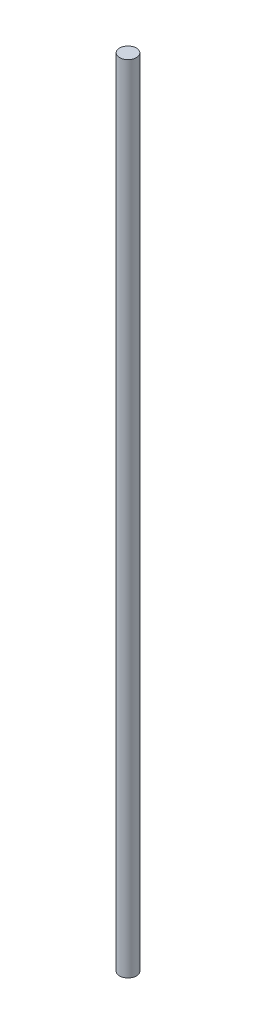
ISO-10303-21;
HEADER;
FILE_DESCRIPTION(('STEP AP214'),'2;1');
FILE_NAME('part.step','',(''),(''),'','','');
FILE_SCHEMA(('AUTOMOTIVE_DESIGN { 1 0 10303 214 1 1 1 1 }'));
ENDSEC;
DATA;
#1=APPLICATION_CONTEXT('core data for automotive mechanical design processes');
#2=APPLICATION_PROTOCOL_DEFINITION('international standard','automotive_design',2000,#1);
#3=PRODUCT_CONTEXT('',#1,'mechanical');
#4=PRODUCT('Part','Part','',(#3));
#5=PRODUCT_RELATED_PRODUCT_CATEGORY('part','',(#4));
#6=PRODUCT_DEFINITION_FORMATION('','',#4);
#7=PRODUCT_DEFINITION_CONTEXT('part definition',#1,'design');
#8=PRODUCT_DEFINITION('design','',#6,#7);
#9=PRODUCT_DEFINITION_SHAPE('','',#8);
#10=(LENGTH_UNIT() NAMED_UNIT(*) SI_UNIT(.MILLI.,.METRE.));
#11=(NAMED_UNIT(*) PLANE_ANGLE_UNIT() SI_UNIT($,.RADIAN.));
#12=(NAMED_UNIT(*) SI_UNIT($,.STERADIAN.) SOLID_ANGLE_UNIT());
#13=UNCERTAINTY_MEASURE_WITH_UNIT(LENGTH_MEASURE(1.E-05),#10,'distance_accuracy_value','');
#14=(GEOMETRIC_REPRESENTATION_CONTEXT(3) GLOBAL_UNCERTAINTY_ASSIGNED_CONTEXT((#13)) GLOBAL_UNIT_ASSIGNED_CONTEXT((#10,
#11,#12)) REPRESENTATION_CONTEXT('',''));
#15=CARTESIAN_POINT('',(0.,0.,0.));
#16=DIRECTION('',(0.,0.,1.));
#17=DIRECTION('',(1.,0.,0.));
#18=AXIS2_PLACEMENT_3D('',#15,#16,#17);
#19=CARTESIAN_POINT('',(0.,190.,0.));
#20=DIRECTION('',(0.,-1.,0.));
#21=DIRECTION('',(0.,0.,-1.));
#22=AXIS2_PLACEMENT_3D('',#19,#20,#21);
#23=CYLINDRICAL_SURFACE('',#22,2.);
#24=CARTESIAN_POINT('',(0.,190.,0.));
#25=DIRECTION('',(0.,1.,0.));
#26=DIRECTION('',(0.,0.,1.));
#27=AXIS2_PLACEMENT_3D('',#24,#25,#26);
#28=CIRCLE('',#27,2.);
#29=CARTESIAN_POINT('',(0.,190.,2.));
#30=VERTEX_POINT('',#29);
#31=EDGE_CURVE('E10',#30,#30,#28,.T.);
#32=ORIENTED_EDGE('',*,*,#31,.F.);
#33=EDGE_LOOP('',(#32));
#34=FACE_BOUND('',#33,.T.);
#35=CARTESIAN_POINT('',(0.,0.,0.));
#36=DIRECTION('',(0.,1.,0.));
#37=DIRECTION('',(0.,0.,1.));
#38=AXIS2_PLACEMENT_3D('',#35,#36,#37);
#39=CIRCLE('',#38,2.);
#40=CARTESIAN_POINT('',(0.,0.,2.));
#41=VERTEX_POINT('',#40);
#42=EDGE_CURVE('E34',#41,#41,#39,.T.);
#43=ORIENTED_EDGE('',*,*,#42,.T.);
#44=EDGE_LOOP('',(#43));
#45=FACE_BOUND('',#44,.T.);
#46=ADVANCED_FACE('F31',(#34,#45),#23,.T.);
#47=CARTESIAN_POINT('',(0.,190.,0.));
#48=DIRECTION('',(0.,1.,0.));
#49=DIRECTION('',(0.,0.,1.));
#50=AXIS2_PLACEMENT_3D('',#47,#48,#49);
#51=PLANE('',#50);
#52=ORIENTED_EDGE('',*,*,#31,.T.);
#53=EDGE_LOOP('',(#52));
#54=FACE_BOUND('',#53,.T.);
#55=ADVANCED_FACE('F46',(#54),#51,.T.);
#56=CARTESIAN_POINT('',(0.,0.,0.));
#57=DIRECTION('',(0.,1.,0.));
#58=DIRECTION('',(0.,0.,1.));
#59=AXIS2_PLACEMENT_3D('',#56,#57,#58);
#60=PLANE('',#59);
#61=ORIENTED_EDGE('',*,*,#42,.F.);
#62=EDGE_LOOP('',(#61));
#63=FACE_BOUND('',#62,.T.);
#64=ADVANCED_FACE('F44',(#63),#60,.F.);
#65=CLOSED_SHELL('',(#46,#55,#64));
#66=MANIFOLD_SOLID_BREP('B2',#65);
#67=ADVANCED_BREP_SHAPE_REPRESENTATION('',(#18,#66),#14);
#68=SHAPE_DEFINITION_REPRESENTATION(#9,#67);
ENDSEC;
END-ISO-10303-21;
